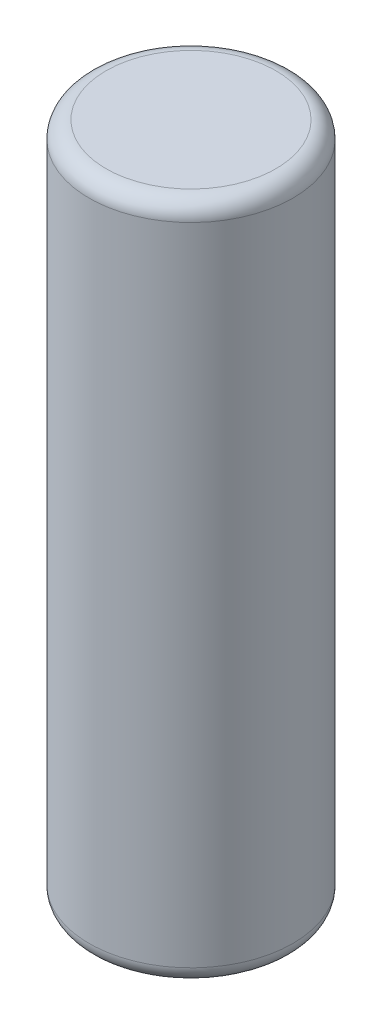
ISO-10303-21;
HEADER;
FILE_DESCRIPTION(('STEP AP214'),'2;1');
FILE_NAME('part.step','',(''),(''),'','','');
FILE_SCHEMA(('AUTOMOTIVE_DESIGN { 1 0 10303 214 1 1 1 1 }'));
ENDSEC;
DATA;
#1=APPLICATION_CONTEXT('core data for automotive mechanical design processes');
#2=APPLICATION_PROTOCOL_DEFINITION('international standard','automotive_design',2000,#1);
#3=PRODUCT_CONTEXT('',#1,'mechanical');
#4=PRODUCT('Part','Part','',(#3));
#5=PRODUCT_RELATED_PRODUCT_CATEGORY('part','',(#4));
#6=PRODUCT_DEFINITION_FORMATION('','',#4);
#7=PRODUCT_DEFINITION_CONTEXT('part definition',#1,'design');
#8=PRODUCT_DEFINITION('design','',#6,#7);
#9=PRODUCT_DEFINITION_SHAPE('','',#8);
#10=(LENGTH_UNIT() NAMED_UNIT(*) SI_UNIT(.MILLI.,.METRE.));
#11=(NAMED_UNIT(*) PLANE_ANGLE_UNIT() SI_UNIT($,.RADIAN.));
#12=(NAMED_UNIT(*) SI_UNIT($,.STERADIAN.) SOLID_ANGLE_UNIT());
#13=UNCERTAINTY_MEASURE_WITH_UNIT(LENGTH_MEASURE(1.E-05),#10,'distance_accuracy_value','');
#14=(GEOMETRIC_REPRESENTATION_CONTEXT(3) GLOBAL_UNCERTAINTY_ASSIGNED_CONTEXT((#13)) GLOBAL_UNIT_ASSIGNED_CONTEXT((#10,
#11,#12)) REPRESENTATION_CONTEXT('',''));
#15=CARTESIAN_POINT('',(0.,0.,0.));
#16=DIRECTION('',(0.,0.,1.));
#17=DIRECTION('',(1.,0.,0.));
#18=AXIS2_PLACEMENT_3D('',#15,#16,#17);
#19=CARTESIAN_POINT('',(-0.75,0.,0.));
#20=DIRECTION('',(0.,-1.,0.));
#21=DIRECTION('',(0.,0.,-1.));
#22=AXIS2_PLACEMENT_3D('',#19,#20,#21);
#23=PLANE('',#22);
#24=CARTESIAN_POINT('',(0.,0.,0.));
#25=DIRECTION('',(0.,1.,0.));
#26=DIRECTION('',(-1.,0.,0.));
#27=AXIS2_PLACEMENT_3D('',#24,#25,#26);
#28=CIRCLE('',#27,1.25);
#29=CARTESIAN_POINT('',(-1.25,0.,0.));
#30=VERTEX_POINT('',#29);
#31=EDGE_CURVE('E66',#30,#30,#28,.T.);
#32=ORIENTED_EDGE('',*,*,#31,.F.);
#33=EDGE_LOOP('',(#32));
#34=FACE_BOUND('',#33,.T.);
#35=ADVANCED_FACE('F15',(#34),#23,.T.);
#36=CARTESIAN_POINT('',(-0.750000000000002,10.,0.));
#37=DIRECTION('',(0.,1.,0.));
#38=DIRECTION('',(0.,0.,1.));
#39=AXIS2_PLACEMENT_3D('',#36,#37,#38);
#40=PLANE('',#39);
#41=CARTESIAN_POINT('',(0.,10.,0.));
#42=DIRECTION('',(0.,-1.,0.));
#43=DIRECTION('',(-1.,0.,0.));
#44=AXIS2_PLACEMENT_3D('',#41,#42,#43);
#45=CIRCLE('',#44,1.25);
#46=CARTESIAN_POINT('',(-1.25,10.,0.));
#47=VERTEX_POINT('',#46);
#48=EDGE_CURVE('E30',#47,#47,#45,.T.);
#49=ORIENTED_EDGE('',*,*,#48,.F.);
#50=EDGE_LOOP('',(#49));
#51=FACE_BOUND('',#50,.T.);
#52=ADVANCED_FACE('F78',(#51),#40,.T.);
#53=CARTESIAN_POINT('',(0.,0.25,0.));
#54=DIRECTION('',(0.,1.,0.));
#55=DIRECTION('',(0.,0.,1.));
#56=AXIS2_PLACEMENT_3D('',#53,#54,#55);
#57=TOROIDAL_SURFACE('',#56,1.25,0.25);
#58=CARTESIAN_POINT('',(0.,0.25,0.));
#59=DIRECTION('',(0.,1.,0.));
#60=DIRECTION('',(-1.,0.,0.));
#61=AXIS2_PLACEMENT_3D('',#58,#59,#60);
#62=CIRCLE('',#61,1.5);
#63=CARTESIAN_POINT('',(-1.5,0.25,0.));
#64=VERTEX_POINT('',#63);
#65=EDGE_CURVE('E25',#64,#64,#62,.T.);
#66=ORIENTED_EDGE('',*,*,#65,.F.);
#67=EDGE_LOOP('',(#66));
#68=FACE_BOUND('',#67,.T.);
#69=ORIENTED_EDGE('',*,*,#31,.T.);
#70=EDGE_LOOP('',(#69));
#71=FACE_BOUND('',#70,.T.);
#72=ADVANCED_FACE('F47',(#68,#71),#57,.T.);
#73=CARTESIAN_POINT('',(0.,9.75,0.));
#74=DIRECTION('',(0.,1.,0.));
#75=DIRECTION('',(0.,0.,1.));
#76=AXIS2_PLACEMENT_3D('',#73,#74,#75);
#77=TOROIDAL_SURFACE('',#76,1.25,0.25);
#78=ORIENTED_EDGE('',*,*,#48,.T.);
#79=EDGE_LOOP('',(#78));
#80=FACE_BOUND('',#79,.T.);
#81=CARTESIAN_POINT('',(0.,9.75,0.));
#82=DIRECTION('',(0.,1.,0.));
#83=DIRECTION('',(-1.,0.,0.));
#84=AXIS2_PLACEMENT_3D('',#81,#82,#83);
#85=CIRCLE('',#84,1.5);
#86=CARTESIAN_POINT('',(-1.5,9.75,0.));
#87=VERTEX_POINT('',#86);
#88=EDGE_CURVE('E10',#87,#87,#85,.F.);
#89=ORIENTED_EDGE('',*,*,#88,.F.);
#90=EDGE_LOOP('',(#89));
#91=FACE_BOUND('',#90,.T.);
#92=ADVANCED_FACE('F42',(#80,#91),#77,.T.);
#93=CARTESIAN_POINT('',(0.,5.,0.));
#94=DIRECTION('',(0.,1.,0.));
#95=DIRECTION('',(-1.,0.,0.));
#96=AXIS2_PLACEMENT_3D('',#93,#94,#95);
#97=CYLINDRICAL_SURFACE('',#96,1.5);
#98=ORIENTED_EDGE('',*,*,#88,.T.);
#99=EDGE_LOOP('',(#98));
#100=FACE_BOUND('',#99,.T.);
#101=ORIENTED_EDGE('',*,*,#65,.T.);
#102=EDGE_LOOP('',(#101));
#103=FACE_BOUND('',#102,.T.);
#104=ADVANCED_FACE('F46',(#100,#103),#97,.T.);
#105=CLOSED_SHELL('',(#35,#52,#72,#92,#104));
#106=MANIFOLD_SOLID_BREP('B1',#105);
#107=ADVANCED_BREP_SHAPE_REPRESENTATION('',(#18,#106),#14);
#108=SHAPE_DEFINITION_REPRESENTATION(#9,#107);
ENDSEC;
END-ISO-10303-21;
